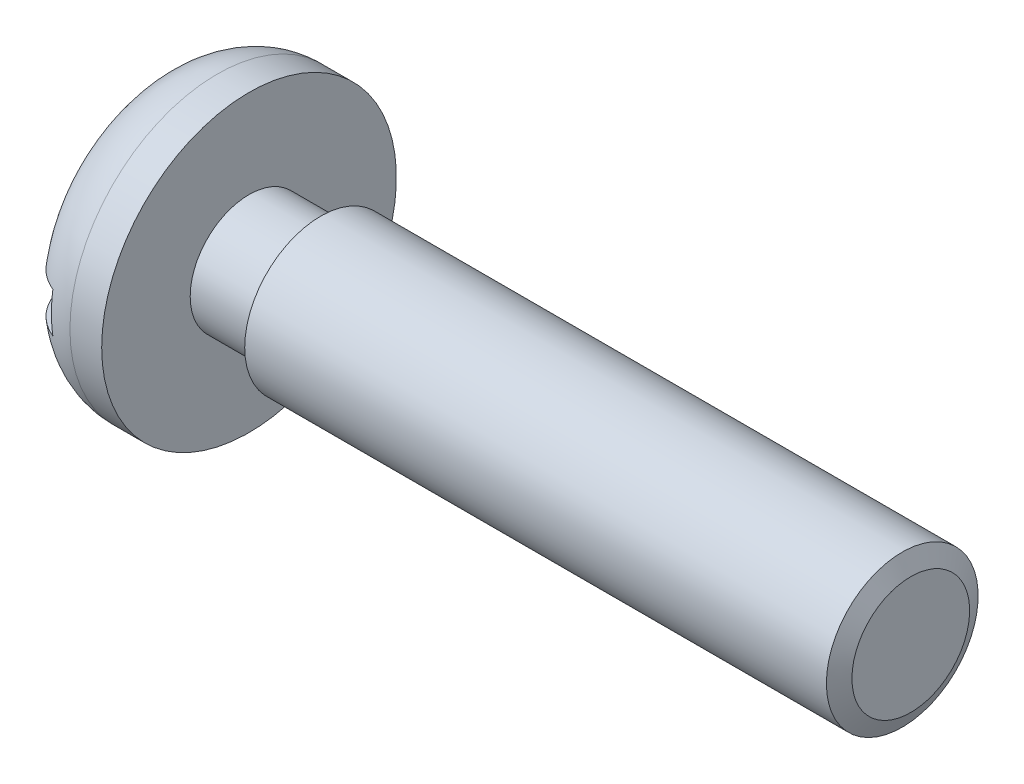
ISO-10303-21;
HEADER;
FILE_DESCRIPTION(('STEP AP214'),'2;1');
FILE_NAME('part.step','',(''),(''),'','','');
FILE_SCHEMA(('AUTOMOTIVE_DESIGN { 1 0 10303 214 1 1 1 1 }'));
ENDSEC;
DATA;
#1=APPLICATION_CONTEXT('core data for automotive mechanical design processes');
#2=APPLICATION_PROTOCOL_DEFINITION('international standard','automotive_design',2000,#1);
#3=PRODUCT_CONTEXT('',#1,'mechanical');
#4=PRODUCT('Part','Part','',(#3));
#5=PRODUCT_RELATED_PRODUCT_CATEGORY('part','',(#4));
#6=PRODUCT_DEFINITION_FORMATION('','',#4);
#7=PRODUCT_DEFINITION_CONTEXT('part definition',#1,'design');
#8=PRODUCT_DEFINITION('design','',#6,#7);
#9=PRODUCT_DEFINITION_SHAPE('','',#8);
#10=(LENGTH_UNIT() NAMED_UNIT(*) SI_UNIT(.MILLI.,.METRE.));
#11=(NAMED_UNIT(*) PLANE_ANGLE_UNIT() SI_UNIT($,.RADIAN.));
#12=(NAMED_UNIT(*) SI_UNIT($,.STERADIAN.) SOLID_ANGLE_UNIT());
#13=UNCERTAINTY_MEASURE_WITH_UNIT(LENGTH_MEASURE(1.E-05),#10,'distance_accuracy_value','');
#14=(GEOMETRIC_REPRESENTATION_CONTEXT(3) GLOBAL_UNCERTAINTY_ASSIGNED_CONTEXT((#13)) GLOBAL_UNIT_ASSIGNED_CONTEXT((#10,
#11,#12)) REPRESENTATION_CONTEXT('',''));
#15=CARTESIAN_POINT('',(0.,0.,0.));
#16=DIRECTION('',(0.,0.,1.));
#17=DIRECTION('',(1.,0.,0.));
#18=AXIS2_PLACEMENT_3D('',#15,#16,#17);
#19=CARTESIAN_POINT('',(-1.3462,1.2319,0.));
#20=DIRECTION('',(1.,0.,0.));
#21=DIRECTION('',(0.,0.,-1.));
#22=AXIS2_PLACEMENT_3D('',#19,#20,#21);
#23=PLANE('',#22);
#24=CARTESIAN_POINT('',(-1.3462,0.,0.));
#25=DIRECTION('',(-1.,0.,0.));
#26=DIRECTION('',(0.,0.,1.));
#27=AXIS2_PLACEMENT_3D('',#24,#25,#26);
#28=CIRCLE('',#27,1.2319);
#29=CARTESIAN_POINT('',(-1.3462,-0.2921,-1.196768649322));
#30=VERTEX_POINT('',#29);
#31=CARTESIAN_POINT('',(-1.3462,-0.2921,1.196768649322));
#32=VERTEX_POINT('',#31);
#33=EDGE_CURVE('E137',#30,#32,#28,.T.);
#34=ORIENTED_EDGE('',*,*,#33,.T.);
#35=DIRECTION('',(0.,0.,-1.));
#36=VECTOR('',#35,1.);
#37=CARTESIAN_POINT('',(-1.3462,-0.2921,0.));
#38=LINE('',#37,#36);
#39=EDGE_CURVE('E138',#32,#30,#38,.T.);
#40=ORIENTED_EDGE('',*,*,#39,.T.);
#41=EDGE_LOOP('',(#34,#40));
#42=FACE_BOUND('',#41,.T.);
#43=ADVANCED_FACE('F15',(#42),#23,.F.);
#44=CARTESIAN_POINT('',(-1.3462,0.2921,1.196768649322));
#45=VERTEX_POINT('',#44);
#46=CARTESIAN_POINT('',(-1.3462,0.2921,-1.196768649322));
#47=VERTEX_POINT('',#46);
#48=EDGE_CURVE('E82',#45,#47,#28,.T.);
#49=ORIENTED_EDGE('',*,*,#48,.T.);
#50=DIRECTION('',(0.,0.,1.));
#51=VECTOR('',#50,1.);
#52=CARTESIAN_POINT('',(-1.3462,0.2921,0.));
#53=LINE('',#52,#51);
#54=EDGE_CURVE('E76',#47,#45,#53,.T.);
#55=ORIENTED_EDGE('',*,*,#54,.T.);
#56=EDGE_LOOP('',(#49,#55));
#57=FACE_BOUND('',#56,.T.);
#58=ADVANCED_FACE('F17',(#57),#23,.F.);
#59=CARTESIAN_POINT('',(9.525,0.,0.));
#60=DIRECTION('',(-1.,0.,0.));
#61=DIRECTION('',(0.,0.,1.));
#62=AXIS2_PLACEMENT_3D('',#59,#60,#61);
#63=PLANE('',#62);
#64=CARTESIAN_POINT('',(9.525,0.,0.));
#65=DIRECTION('',(-1.,0.,0.));
#66=DIRECTION('',(0.,0.,1.));
#67=AXIS2_PLACEMENT_3D('',#64,#65,#66);
#68=CIRCLE('',#67,0.8471);
#69=CARTESIAN_POINT('',(9.525,0.,0.8471));
#70=VERTEX_POINT('',#69);
#71=EDGE_CURVE('E107',#70,#70,#68,.T.);
#72=ORIENTED_EDGE('',*,*,#71,.F.);
#73=EDGE_LOOP('',(#72));
#74=FACE_BOUND('',#73,.T.);
#75=ADVANCED_FACE('F248',(#74),#63,.F.);
#76=CARTESIAN_POINT('',(9.525,0.,0.));
#77=DIRECTION('',(-1.,0.,0.));
#78=DIRECTION('',(0.,0.,1.));
#79=AXIS2_PLACEMENT_3D('',#76,#77,#78);
#80=CONICAL_SURFACE('',#79,0.8471,1.10714871779409);
#81=CARTESIAN_POINT('',(9.40245,0.,0.));
#82=DIRECTION('',(-1.,0.,0.));
#83=DIRECTION('',(0.,0.,1.));
#84=AXIS2_PLACEMENT_3D('',#81,#82,#83);
#85=CIRCLE('',#84,1.0922);
#86=CARTESIAN_POINT('',(9.40245,0.,1.0922));
#87=VERTEX_POINT('',#86);
#88=EDGE_CURVE('E111',#87,#87,#85,.T.);
#89=ORIENTED_EDGE('',*,*,#88,.F.);
#90=EDGE_LOOP('',(#89));
#91=FACE_BOUND('',#90,.T.);
#92=ORIENTED_EDGE('',*,*,#71,.T.);
#93=EDGE_LOOP('',(#92));
#94=FACE_BOUND('',#93,.T.);
#95=ADVANCED_FACE('F237',(#91,#94),#80,.T.);
#96=CARTESIAN_POINT('',(-1.3462,0.,0.));
#97=DIRECTION('',(-1.,0.,0.));
#98=DIRECTION('',(0.,0.,1.));
#99=AXIS2_PLACEMENT_3D('',#96,#97,#98);
#100=CYLINDRICAL_SURFACE('',#99,1.0922);
#101=CARTESIAN_POINT('',(1.02969285714286,0.,0.));
#102=DIRECTION('',(-1.,0.,0.));
#103=DIRECTION('',(0.,0.,1.));
#104=AXIS2_PLACEMENT_3D('',#101,#102,#103);
#105=CIRCLE('',#104,1.0922);
#106=CARTESIAN_POINT('',(1.02969285714286,0.,1.0922));
#107=VERTEX_POINT('',#106);
#108=EDGE_CURVE('E115',#107,#107,#105,.T.);
#109=ORIENTED_EDGE('',*,*,#108,.F.);
#110=EDGE_LOOP('',(#109));
#111=FACE_BOUND('',#110,.T.);
#112=ORIENTED_EDGE('',*,*,#88,.T.);
#113=EDGE_LOOP('',(#112));
#114=FACE_BOUND('',#113,.T.);
#115=ADVANCED_FACE('F226',(#111,#114),#100,.T.);
#116=CARTESIAN_POINT('',(1.02969285714286,0.,0.));
#117=DIRECTION('',(1.,0.,0.));
#118=DIRECTION('',(0.,0.,-1.));
#119=AXIS2_PLACEMENT_3D('',#116,#117,#118);
#120=CONICAL_SURFACE('',#119,1.0922,1.10714871779409);
#121=CARTESIAN_POINT('',(0.907142857142857,0.,0.));
#122=DIRECTION('',(-1.,0.,0.));
#123=DIRECTION('',(0.,0.,1.));
#124=AXIS2_PLACEMENT_3D('',#121,#122,#123);
#125=CIRCLE('',#124,0.8471);
#126=CARTESIAN_POINT('',(0.907142857142857,0.,0.8471));
#127=VERTEX_POINT('',#126);
#128=EDGE_CURVE('E119',#127,#127,#125,.T.);
#129=ORIENTED_EDGE('',*,*,#128,.F.);
#130=EDGE_LOOP('',(#129));
#131=FACE_BOUND('',#130,.T.);
#132=ORIENTED_EDGE('',*,*,#108,.T.);
#133=EDGE_LOOP('',(#132));
#134=FACE_BOUND('',#133,.T.);
#135=ADVANCED_FACE('F215',(#131,#134),#120,.T.);
#136=CARTESIAN_POINT('',(-1.3462,0.,0.));
#137=DIRECTION('',(-1.,0.,0.));
#138=DIRECTION('',(0.,0.,1.));
#139=AXIS2_PLACEMENT_3D('',#136,#137,#138);
#140=CYLINDRICAL_SURFACE('',#139,0.8471);
#141=CARTESIAN_POINT('',(0.,0.,0.));
#142=DIRECTION('',(-1.,0.,0.));
#143=DIRECTION('',(0.,0.,1.));
#144=AXIS2_PLACEMENT_3D('',#141,#142,#143);
#145=CIRCLE('',#144,0.8471);
#146=CARTESIAN_POINT('',(0.,0.,0.8471));
#147=VERTEX_POINT('',#146);
#148=EDGE_CURVE('E123',#147,#147,#145,.T.);
#149=ORIENTED_EDGE('',*,*,#148,.F.);
#150=EDGE_LOOP('',(#149));
#151=FACE_BOUND('',#150,.T.);
#152=ORIENTED_EDGE('',*,*,#128,.T.);
#153=EDGE_LOOP('',(#152));
#154=FACE_BOUND('',#153,.T.);
#155=ADVANCED_FACE('F204',(#151,#154),#140,.T.);
#156=CARTESIAN_POINT('',(0.,0.8471,0.));
#157=DIRECTION('',(-1.,0.,0.));
#158=DIRECTION('',(0.,0.,1.));
#159=AXIS2_PLACEMENT_3D('',#156,#157,#158);
#160=PLANE('',#159);
#161=CARTESIAN_POINT('',(0.,0.,0.));
#162=DIRECTION('',(-1.,0.,0.));
#163=DIRECTION('',(0.,0.,1.));
#164=AXIS2_PLACEMENT_3D('',#161,#162,#163);
#165=CIRCLE('',#164,2.1209);
#166=CARTESIAN_POINT('',(0.,0.,2.1209));
#167=VERTEX_POINT('',#166);
#168=EDGE_CURVE('E127',#167,#167,#165,.T.);
#169=ORIENTED_EDGE('',*,*,#168,.F.);
#170=EDGE_LOOP('',(#169));
#171=FACE_BOUND('',#170,.T.);
#172=ORIENTED_EDGE('',*,*,#148,.T.);
#173=EDGE_LOOP('',(#172));
#174=FACE_BOUND('',#173,.T.);
#175=ADVANCED_FACE('F194',(#171,#174),#160,.F.);
#176=CARTESIAN_POINT('',(-1.3462,0.,0.));
#177=DIRECTION('',(-1.,0.,0.));
#178=DIRECTION('',(0.,0.,1.));
#179=AXIS2_PLACEMENT_3D('',#176,#177,#178);
#180=CYLINDRICAL_SURFACE('',#179,2.1209);
#181=CARTESIAN_POINT('',(-0.4572,0.,0.));
#182=DIRECTION('',(-1.,0.,0.));
#183=DIRECTION('',(0.,0.,1.));
#184=AXIS2_PLACEMENT_3D('',#181,#182,#183);
#185=CIRCLE('',#184,2.1209);
#186=CARTESIAN_POINT('',(-0.4572,0.,2.1209));
#187=VERTEX_POINT('',#186);
#188=EDGE_CURVE('E131',#187,#187,#185,.T.);
#189=ORIENTED_EDGE('',*,*,#188,.F.);
#190=EDGE_LOOP('',(#189));
#191=FACE_BOUND('',#190,.T.);
#192=ORIENTED_EDGE('',*,*,#168,.T.);
#193=EDGE_LOOP('',(#192));
#194=FACE_BOUND('',#193,.T.);
#195=ADVANCED_FACE('F185',(#191,#194),#180,.T.);
#196=CARTESIAN_POINT('',(-0.4572,0.,0.));
#197=DIRECTION('',(-1.,0.,0.));
#198=DIRECTION('',(0.,0.,1.));
#199=AXIS2_PLACEMENT_3D('',#196,#197,#198);
#200=TOROIDAL_SURFACE('',#199,1.2319,0.889);
#201=CARTESIAN_POINT('',(-0.7874,0.,0.));
#202=DIRECTION('',(1.,0.,0.));
#203=DIRECTION('',(0.,0.,-1.));
#204=AXIS2_PLACEMENT_3D('',#201,#202,#203);
#205=CIRCLE('',#204,2.05730230191102);
#206=CARTESIAN_POINT('',(-0.7874,0.2921,2.03646025039733));
#207=VERTEX_POINT('',#206);
#208=CARTESIAN_POINT('',(-0.7874,-0.2921,2.03646025039733));
#209=VERTEX_POINT('',#208);
#210=EDGE_CURVE('E61',#207,#209,#205,.T.);
#211=ORIENTED_EDGE('',*,*,#210,.T.);
#212=CARTESIAN_POINT('',(-0.992672438637413,-0.2921,0.432934305643319));
#213=CARTESIAN_POINT('',(-0.951976302403638,-0.2921,0.395882314610575));
#214=CARTESIAN_POINT('',(-0.908727308114687,-0.2921,0.361624142766205));
#215=CARTESIAN_POINT('',(-0.840630830973308,-0.2921,0.314956422780139));
#216=CARTESIAN_POINT('',(-0.817376844307591,-0.2921,0.300178124351799));
#217=CARTESIAN_POINT('',(-0.769830336334795,-0.2921,0.272408816585435));
#218=CARTESIAN_POINT('',(-0.745538319363267,-0.2921,0.259416951949301));
#219=CARTESIAN_POINT('',(-0.691476053082714,-0.2921,0.233453302492282));
#220=CARTESIAN_POINT('',(-0.661501470432795,-0.2921,0.22089837012876));
#221=CARTESIAN_POINT('',(-0.600181210266825,-0.2921,0.200024753087824));
#222=CARTESIAN_POINT('',(-0.568842288590604,-0.2921,0.191687312499439));
#223=CARTESIAN_POINT('',(-0.509599457312778,-0.2921,0.181785972508896));
#224=CARTESIAN_POINT('',(-0.481836724849506,-0.2921,0.179430749928932));
#225=CARTESIAN_POINT('',(-0.426342853074537,-0.2921,0.179800268752367));
#226=CARTESIAN_POINT('',(-0.398611722176877,-0.2921,0.182526141735702));
#227=CARTESIAN_POINT('',(-0.334096578427921,-0.2921,0.194097869512075));
#228=CARTESIAN_POINT('',(-0.297666095143047,-0.2921,0.20480069646197));
#229=CARTESIAN_POINT('',(-0.226665266455918,-0.2921,0.231455710401772));
#230=CARTESIAN_POINT('',(-0.192108063254158,-0.2921,0.247440493728884));
#231=CARTESIAN_POINT('',(-0.129893014009047,-0.2921,0.280465132785374));
#232=CARTESIAN_POINT('',(-0.101966495091048,-0.2921,0.297006626603626));
#233=CARTESIAN_POINT('',(-0.0475848363779582,-0.2921,0.332362694096872));
#234=CARTESIAN_POINT('',(-0.021130508844512,-0.2921,0.351178504787953));
#235=CARTESIAN_POINT('',(0.0557498887027582,-0.2921,0.410647327942976));
#236=CARTESIAN_POINT('',(0.103837699645755,-0.2921,0.45440039799162));
#237=CARTESIAN_POINT('',(0.19267941328707,-0.2921,0.54994205808474));
#238=CARTESIAN_POINT('',(0.233325092281033,-0.2921,0.601831512275902));
#239=CARTESIAN_POINT('',(0.30452091587593,-0.2921,0.712152698523906));
#240=CARTESIAN_POINT('',(0.335078076750835,-0.2921,0.770579845778615));
#241=CARTESIAN_POINT('',(0.382651320036513,-0.2921,0.888038597832505));
#242=CARTESIAN_POINT('',(0.400457200702972,-0.2921,0.946749442702547));
#243=CARTESIAN_POINT('',(0.424745459936411,-0.2921,1.06648802241002));
#244=CARTESIAN_POINT('',(0.431231788575531,-0.2921,1.12751494143121));
#245=CARTESIAN_POINT('',(0.432243697825684,-0.2921,1.24352816725672));
#246=CARTESIAN_POINT('',(0.427904016121639,-0.2921,1.29850622045822));
#247=CARTESIAN_POINT('',(0.409535255455774,-0.2921,1.40681520034198));
#248=CARTESIAN_POINT('',(0.395510450915781,-0.2921,1.46014684280614));
#249=CARTESIAN_POINT('',(0.359061437997411,-0.2921,1.56072841183747));
#250=CARTESIAN_POINT('',(0.337110558223342,-0.2921,1.60815030380737));
#251=CARTESIAN_POINT('',(0.285352482255086,-0.2921,1.69849554453694));
#252=CARTESIAN_POINT('',(0.255546454905018,-0.2921,1.74141956125242));
#253=CARTESIAN_POINT('',(0.189795813324276,-0.2921,1.82038320852261));
#254=CARTESIAN_POINT('',(0.154031761032469,-0.2921,1.85657330582249));
#255=CARTESIAN_POINT('',(0.0768609189134639,-0.2921,1.92233195432511));
#256=CARTESIAN_POINT('',(0.0354546294751286,-0.2921,1.95190109210192));
#257=CARTESIAN_POINT('',(-0.051199372290232,-0.2921,2.00316417171778));
#258=CARTESIAN_POINT('',(-0.0963859756334818,-0.2921,2.02496146011344));
#259=CARTESIAN_POINT('',(-0.189794863444509,-0.2921,2.06059947774309));
#260=CARTESIAN_POINT('',(-0.238017013247673,-0.2921,2.07444055965917));
#261=CARTESIAN_POINT('',(-0.335764668045911,-0.2921,2.09368641852875));
#262=CARTESIAN_POINT('',(-0.385278691349902,-0.2921,2.09914955190282));
#263=CARTESIAN_POINT('',(-0.484519453606647,-0.2921,2.10166360796056));
#264=CARTESIAN_POINT('',(-0.534246188283067,-0.2921,2.09871469897306));
#265=CARTESIAN_POINT('',(-0.632375738931346,-0.2921,2.0845089698509));
#266=CARTESIAN_POINT('',(-0.680781443517738,-0.2921,2.07327208755944));
#267=CARTESIAN_POINT('',(-0.77502314738635,-0.2921,2.04284266210274));
#268=CARTESIAN_POINT('',(-0.820859151169377,-0.2921,2.02365013287223));
#269=CARTESIAN_POINT('',(-0.908739661466676,-0.2921,1.97783533101026));
#270=CARTESIAN_POINT('',(-0.950778430758976,-0.2921,1.9512020567031));
#271=CARTESIAN_POINT('',(-1.02981938083941,-0.2921,1.89129319939671));
#272=CARTESIAN_POINT('',(-1.06682148964855,-0.2921,1.85801752148754));
#273=CARTESIAN_POINT('',(-1.13497797888147,-0.2921,1.78557604040786));
#274=CARTESIAN_POINT('',(-1.16609763403501,-0.2921,1.74637757680937));
#275=CARTESIAN_POINT('',(-1.22139984472465,-0.2921,1.66336245659058));
#276=CARTESIAN_POINT('',(-1.2455821264248,-0.2921,1.61954561776446));
#277=CARTESIAN_POINT('',(-1.28664519432551,-0.2921,1.52800704096665));
#278=CARTESIAN_POINT('',(-1.30343834606938,-0.2921,1.48024601864444));
#279=CARTESIAN_POINT('',(-1.32894363580326,-0.2921,1.38261880771803));
#280=CARTESIAN_POINT('',(-1.33765541348183,-0.2921,1.33275252535354));
#281=CARTESIAN_POINT('',(-1.34698928328245,-0.2921,1.23122253976434));
#282=CARTESIAN_POINT('',(-1.34743873377999,-0.2921,1.17954304448759));
#283=CARTESIAN_POINT('',(-1.33997550050584,-0.2921,1.0767962437406));
#284=CARTESIAN_POINT('',(-1.33206131228534,-0.2921,1.02572905008238));
#285=CARTESIAN_POINT('',(-1.30785496246849,-0.2921,0.923599249518503));
#286=CARTESIAN_POINT('',(-1.29125928355239,-0.2921,0.872608860886494));
#287=CARTESIAN_POINT('',(-1.25027871991642,-0.2921,0.773888674672268));
#288=CARTESIAN_POINT('',(-1.22589419258904,-0.2921,0.726158727606152));
#289=CARTESIAN_POINT('',(-1.17009543264154,-0.2921,0.634594296147874));
#290=CARTESIAN_POINT('',(-1.13863614956343,-0.2921,0.590787409837325));
#291=CARTESIAN_POINT('',(-1.06982489913658,-0.2921,0.508072521804637));
#292=CARTESIAN_POINT('',(-1.03246931055133,-0.2921,0.469167557193672));
#293=CARTESIAN_POINT('',(-0.992672438637413,-0.2921,0.432934305643319));
#294=B_SPLINE_CURVE_WITH_KNOTS('',3,(#212,#213,#214,#215,#216,#217,#218,#219,#220,#221,#222,
#223,#224,#225,#226,#227,#228,#229,#230,#231,#232,#233,#234,#235,#236,#237,#238,#239,#240,#241,
#242,#243,#244,#245,#246,#247,#248,#249,#250,#251,#252,#253,#254,#255,#256,#257,#258,#259,#260,
#261,#262,#263,#264,#265,#266,#267,#268,#269,#270,#271,#272,#273,#274,#275,#276,#277,#278,#279,
#280,#281,#282,#283,#284,#285,#286,#287,#288,#289,#290,#291,#292,#293),.UNSPECIFIED.,.T.,.F.,(4,
2,2,2,2,2,2,2,2,2,2,2,2,2,2,2,2,2,2,2,2,2,2,2,2,2,2,2,2,2,2,2,2,2,2,2,2,2,2,2,4),(0.,
0.16495775981017,0.24755626720245,0.330115089844927,0.427398573052825,0.524245530215674,
0.60739299954584,0.69055898835636,0.803805959361426,0.91776528282531,1.01501518531125,
1.11231822271878,1.30643675482596,1.50318604715208,1.69979821634306,1.88282418140949,
2.06578626493389,2.23039162657576,2.39492438785135,2.55092420669776,2.70690082590108,
2.8588056311825,3.01069697335346,3.16048575872783,3.31026790376476,3.45900192815745,
3.60773297633499,3.75610739400144,3.90448155178353,4.05307626315311,4.20167309786912,
4.3511214611586,4.50057572274764,4.65175763003305,4.80294627750292,4.95729050769183,
5.11166250600081,5.27183282781698,5.43199580124925,5.59320908443223,5.75452176533789),.UNSPECIFIED.);
#295=EDGE_CURVE('E10',#209,#32,#294,.T.);
#296=ORIENTED_EDGE('',*,*,#295,.T.);
#297=ORIENTED_EDGE('',*,*,#33,.F.);
#298=CARTESIAN_POINT('',(-1.06697298726154,-0.2921,-1.85596879314736));
#299=CARTESIAN_POINT('',(-1.03098548144302,-0.2921,-1.89030721062701));
#300=CARTESIAN_POINT('',(-0.992107884086906,-0.2921,-1.9216253737167));
#301=CARTESIAN_POINT('',(-0.909644399354977,-0.2921,-1.97730508815571));
#302=CARTESIAN_POINT('',(-0.866057577568001,-0.2921,-2.00166525538257));
#303=CARTESIAN_POINT('',(-0.775399479777941,-0.2921,-2.04271054069887));
#304=CARTESIAN_POINT('',(-0.728327719279927,-0.2921,-2.05939458927808));
#305=CARTESIAN_POINT('',(-0.632046826721519,-0.2921,-2.08458876370733));
#306=CARTESIAN_POINT('',(-0.582837789836314,-0.2921,-2.09309925314537));
#307=CARTESIAN_POINT('',(-0.483872766325003,-0.2921,-2.10168005939517));
#308=CARTESIAN_POINT('',(-0.43411946886111,-0.2921,-2.10178141268704));
#309=CARTESIAN_POINT('',(-0.335304317498453,-0.2921,-2.09361914516227));
#310=CARTESIAN_POINT('',(-0.286242456640679,-0.2921,-2.08535560859567));
#311=CARTESIAN_POINT('',(-0.190258784568471,-0.2921,-2.06072057304478));
#312=CARTESIAN_POINT('',(-0.143334606238082,-0.2921,-2.04435829270059));
#313=CARTESIAN_POINT('',(-0.0528890535515041,-0.2921,-2.00400875494042));
#314=CARTESIAN_POINT('',(-0.00936769366654838,-0.2921,-1.98002146509961));
#315=CARTESIAN_POINT('',(0.0731727925832212,-0.2921,-1.9250437981044));
#316=CARTESIAN_POINT('',(0.112179208450556,-0.2921,-1.89403434353768));
#317=CARTESIAN_POINT('',(0.184477690524985,-0.2921,-1.82595030639236));
#318=CARTESIAN_POINT('',(0.217769648109022,-0.2921,-1.78887560854899));
#319=CARTESIAN_POINT('',(0.277970868440114,-0.2921,-1.70943388883647));
#320=CARTESIAN_POINT('',(0.304831471891644,-0.2921,-1.66703000719749));
#321=CARTESIAN_POINT('',(0.351162133369711,-0.2921,-1.57836386916823));
#322=CARTESIAN_POINT('',(0.37063182752706,-0.2921,-1.53210142294986));
#323=CARTESIAN_POINT('',(0.401948275669985,-0.2921,-1.43634785180313));
#324=CARTESIAN_POINT('',(0.413684268389264,-0.2921,-1.38682053982095));
#325=CARTESIAN_POINT('',(0.428889824774922,-0.2921,-1.28651981559142));
#326=CARTESIAN_POINT('',(0.432358956784081,-0.2921,-1.23574633841493));
#327=CARTESIAN_POINT('',(0.431078862405955,-0.2921,-1.13303224849355));
#328=CARTESIAN_POINT('',(0.426121042227419,-0.2921,-1.08109434943144));
#329=CARTESIAN_POINT('',(0.407936632360012,-0.2921,-0.978693150561658));
#330=CARTESIAN_POINT('',(0.394708332033858,-0.2921,-0.928230158079346));
#331=CARTESIAN_POINT('',(0.359808634821553,-0.2921,-0.827747809325714));
#332=CARTESIAN_POINT('',(0.337781453922837,-0.2921,-0.777852421282294));
#333=CARTESIAN_POINT('',(0.286279522453327,-0.2921,-0.682098190054024));
#334=CARTESIAN_POINT('',(0.256804592194011,-0.2921,-0.636239444295439));
#335=CARTESIAN_POINT('',(0.188793411919309,-0.2921,-0.545776261529059));
#336=CARTESIAN_POINT('',(0.149712472283708,-0.2921,-0.50158272253969));
#337=CARTESIAN_POINT('',(0.0654029337913393,-0.2921,-0.41943681508496));
#338=CARTESIAN_POINT('',(0.0201666005199633,-0.2921,-0.38149243359891));
#339=CARTESIAN_POINT('',(-0.0655144480877994,-0.2921,-0.319656520268563));
#340=CARTESIAN_POINT('',(-0.105030774172858,-0.2921,-0.294479834363365));
#341=CARTESIAN_POINT('',(-0.166517885754436,-0.2921,-0.260777339308461));
#342=CARTESIAN_POINT('',(-0.187380638483858,-0.2921,-0.250220931364947));
#343=CARTESIAN_POINT('',(-0.22985543169453,-0.2921,-0.230757236114179));
#344=CARTESIAN_POINT('',(-0.251467077599952,-0.2921,-0.221849095595576));
#345=CARTESIAN_POINT('',(-0.30141375983301,-0.2921,-0.203993981505409));
#346=CARTESIAN_POINT('',(-0.329988040695985,-0.2921,-0.195686487556193));
#347=CARTESIAN_POINT('',(-0.388020025038903,-0.2921,-0.183882848722512));
#348=CARTESIAN_POINT('',(-0.417471947697693,-0.2921,-0.180360265915577));
#349=CARTESIAN_POINT('',(-0.476684100732781,-0.2921,-0.179069970047914));
#350=CARTESIAN_POINT('',(-0.506445129601433,-0.2921,-0.181335562051191));
#351=CARTESIAN_POINT('',(-0.565212057501611,-0.2921,-0.191005491205652));
#352=CARTESIAN_POINT('',(-0.594213100956741,-0.2921,-0.198437083159847));
#353=CARTESIAN_POINT('',(-0.645881942505189,-0.2921,-0.215317364373907));
#354=CARTESIAN_POINT('',(-0.668755620572376,-0.2921,-0.224168557723448));
#355=CARTESIAN_POINT('',(-0.713679278072415,-0.2921,-0.243778326687423));
#356=CARTESIAN_POINT('',(-0.735728656526258,-0.2921,-0.254538262309401));
#357=CARTESIAN_POINT('',(-0.800727778021493,-0.2921,-0.289148454517574));
#358=CARTESIAN_POINT('',(-0.842453164995195,-0.2921,-0.315301690704514));
#359=CARTESIAN_POINT('',(-0.936436817387702,-0.2921,-0.382491279483391));
#360=CARTESIAN_POINT('',(-0.987265338494482,-0.2921,-0.425532053164752));
#361=CARTESIAN_POINT('',(-1.08091844661583,-0.2921,-0.519471660579893));
#362=CARTESIAN_POINT('',(-1.12375749870863,-0.2921,-0.570355982126777));
#363=CARTESIAN_POINT('',(-1.1993519535428,-0.2921,-0.678768612122051));
#364=CARTESIAN_POINT('',(-1.23216234462503,-0.2921,-0.736258221148343));
#365=CARTESIAN_POINT('',(-1.2861633281036,-0.2921,-0.856512120051585));
#366=CARTESIAN_POINT('',(-1.30735531410856,-0.2921,-0.919275776273221));
#367=CARTESIAN_POINT('',(-1.33494887975992,-0.2921,-1.04014019393372));
#368=CARTESIAN_POINT('',(-1.3428076709284,-0.2921,-1.09790993294163));
#369=CARTESIAN_POINT('',(-1.34782264907081,-0.2921,-1.21390959589146));
#370=CARTESIAN_POINT('',(-1.34498520279187,-0.2921,-1.27213922549821));
#371=CARTESIAN_POINT('',(-1.3291314528051,-0.2921,-1.38250251927555));
#372=CARTESIAN_POINT('',(-1.31693458217976,-0.2921,-1.43475505322979));
#373=CARTESIAN_POINT('',(-1.28358835438538,-0.2921,-1.53631137202184));
#374=CARTESIAN_POINT('',(-1.26244379484754,-0.2921,-1.58561672095573));
#375=CARTESIAN_POINT('',(-1.21483378384803,-0.2921,-1.67403025523813));
#376=CARTESIAN_POINT('',(-1.18931514441613,-0.2921,-1.71365149524175));
#377=CARTESIAN_POINT('',(-1.13238106226083,-0.2921,-1.78840264887311));
#378=CARTESIAN_POINT('',(-1.10096636246282,-0.2921,-1.82353312741687));
#379=CARTESIAN_POINT('',(-1.06697298726154,-0.2921,-1.85596879314736));
#380=B_SPLINE_CURVE_WITH_KNOTS('',3,(#298,#299,#300,#301,#302,#303,#304,#305,#306,#307,#308,
#309,#310,#311,#312,#313,#314,#315,#316,#317,#318,#319,#320,#321,#322,#323,#324,#325,#326,#327,
#328,#329,#330,#331,#332,#333,#334,#335,#336,#337,#338,#339,#340,#341,#342,#343,#344,#345,#346,
#347,#348,#349,#350,#351,#352,#353,#354,#355,#356,#357,#358,#359,#360,#361,#362,#363,#364,#365,
#366,#367,#368,#369,#370,#371,#372,#373,#374,#375,#376,#377,#378,#379),.UNSPECIFIED.,.T.,.F.,(4,
2,2,2,2,2,2,2,2,2,2,2,2,2,2,2,2,2,2,2,2,2,2,2,2,2,2,2,2,2,2,2,2,2,2,2,2,2,2,2,4),(0.,
0.14905902386792,0.298147678751285,0.447257099805331,0.596359887652682,0.744912341640851,
0.89346329944394,1.04184555215146,1.19022843585283,1.33901937952592,1.48781315117269,
1.63769943053109,1.78759308813289,1.93958936812845,2.09159358449268,2.24741541426667,
2.40326948435204,2.56619358506477,2.72912161694988,2.90540399980085,3.08190996752683,
3.22210912823777,3.2921977247132,3.36224993830917,3.451224485425,3.53970539675627,
3.62869657101617,3.71816084426597,3.79164316554849,3.86517805593972,4.01248592577054,
4.21139011458747,4.40993061153603,4.60736210675416,4.80476991520433,4.97874179997717,
5.15261014740244,5.31278224788245,5.47286857482533,5.61368570915038,5.75448511189392),.UNSPECIFIED.);
#381=CARTESIAN_POINT('',(-0.7874,-0.2921,-2.03646025039733));
#382=VERTEX_POINT('',#381);
#383=EDGE_CURVE('E43',#30,#382,#380,.T.);
#384=ORIENTED_EDGE('',*,*,#383,.T.);
#385=CARTESIAN_POINT('',(-0.7874,0.2921,-2.03646025039733));
#386=VERTEX_POINT('',#385);
#387=EDGE_CURVE('E68',#382,#386,#205,.T.);
#388=ORIENTED_EDGE('',*,*,#387,.T.);
#389=CARTESIAN_POINT('',(-1.06697298726154,0.2921,-1.85596879314736));
#390=CARTESIAN_POINT('',(-1.10354708191385,0.2921,-1.8210667472002));
#391=CARTESIAN_POINT('',(-1.13716869677334,0.2921,-1.78301322630452));
#392=CARTESIAN_POINT('',(-1.19753583165128,0.2921,-1.70174544545054));
#393=CARTESIAN_POINT('',(-1.22427214476066,0.2921,-1.65852438740261));
#394=CARTESIAN_POINT('',(-1.27010367740325,0.2921,-1.56826934336279));
#395=CARTESIAN_POINT('',(-1.28920801116125,0.2921,-1.52123998654877));
#396=CARTESIAN_POINT('',(-1.31936631369945,0.2921,-1.42469028143375));
#397=CARTESIAN_POINT('',(-1.33042258060802,0.2921,-1.37517064855333));
#398=CARTESIAN_POINT('',(-1.3444171370963,0.2921,-1.27425757644573));
#399=CARTESIAN_POINT('',(-1.34723340776844,0.2921,-1.22284727839722));
#400=CARTESIAN_POINT('',(-1.34449205791633,0.2921,-1.12025065901046));
#401=CARTESIAN_POINT('',(-1.3389323687076,0.2921,-1.06906439613576));
#402=CARTESIAN_POINT('',(-1.31946016188711,0.2921,-0.966473499845394));
#403=CARTESIAN_POINT('',(-1.30526492171769,0.2921,-0.915122743630748));
#404=CARTESIAN_POINT('',(-1.2689597835808,0.2921,-0.815335009058525));
#405=CARTESIAN_POINT('',(-1.24685117327621,0.2921,-0.766897558145079));
#406=CARTESIAN_POINT('',(-1.1939911224401,0.2921,-0.67101952646385));
#407=CARTESIAN_POINT('',(-1.16278700313543,0.2921,-0.623829098727242));
#408=CARTESIAN_POINT('',(-1.09360263837529,0.2921,-0.534667399266872));
#409=CARTESIAN_POINT('',(-1.05561334737469,0.2921,-0.492703223174028));
#410=CARTESIAN_POINT('',(-0.969581240619593,0.2921,-0.410267090352194));
#411=CARTESIAN_POINT('',(-0.920892646937336,0.2921,-0.370464284514564));
#412=CARTESIAN_POINT('',(-0.843677993687896,0.2921,-0.316835843256897));
#413=CARTESIAN_POINT('',(-0.817219651673264,0.2921,-0.299961108071455));
#414=CARTESIAN_POINT('',(-0.762963103697467,0.2921,-0.268540844362752));
#415=CARTESIAN_POINT('',(-0.735165994716016,0.2921,-0.253993449692668));
#416=CARTESIAN_POINT('',(-0.677570247336987,0.2921,-0.227522190381186));
#417=CARTESIAN_POINT('',(-0.647740831184659,0.2921,-0.215663922683793));
#418=CARTESIAN_POINT('',(-0.586816178107002,0.2921,-0.196329123679199));
#419=CARTESIAN_POINT('',(-0.555729797897136,0.2921,-0.188826239385564));
#420=CARTESIAN_POINT('',(-0.492099654757595,0.2921,-0.179866088840567));
#421=CARTESIAN_POINT('',(-0.459540534988772,0.2921,-0.178507430150808));
#422=CARTESIAN_POINT('',(-0.394805687860516,0.2921,-0.18263583016526));
#423=CARTESIAN_POINT('',(-0.362631540001973,0.2921,-0.188145031534325));
#424=CARTESIAN_POINT('',(-0.289499772419427,0.2921,-0.20687927202918));
#425=CARTESIAN_POINT('',(-0.249070384282891,0.2921,-0.22202472634886));
#426=CARTESIAN_POINT('',(-0.170637726489418,0.2921,-0.257823025914493));
#427=CARTESIAN_POINT('',(-0.132647305203846,0.2921,-0.27850247413932));
#428=CARTESIAN_POINT('',(-0.0675149535839641,0.2921,-0.31886513611093));
#429=CARTESIAN_POINT('',(-0.0398569105660963,0.2921,-0.337723568663297));
#430=CARTESIAN_POINT('',(0.0137983112234526,0.2921,-0.377676168452173));
#431=CARTESIAN_POINT('',(0.0397948540346582,0.2921,-0.398771183651823));
#432=CARTESIAN_POINT('',(0.114893648233122,0.2921,-0.4650991006688));
#433=CARTESIAN_POINT('',(0.161287853246664,0.2921,-0.513488904302052));
#434=CARTESIAN_POINT('',(0.244603002868148,0.2921,-0.617493032025491));
#435=CARTESIAN_POINT('',(0.281565588738332,0.2921,-0.673073907263759));
#436=CARTESIAN_POINT('',(0.344323119589687,0.2921,-0.79028222891346));
#437=CARTESIAN_POINT('',(0.370120497043002,0.2921,-0.851908354703502));
#438=CARTESIAN_POINT('',(0.406821920435411,0.2921,-0.972278101098645));
#439=CARTESIAN_POINT('',(0.419021537327799,0.2921,-1.03062751120777));
#440=CARTESIAN_POINT('',(0.432411449928743,0.2921,-1.14857654095137));
#441=CARTESIAN_POINT('',(0.433608397243461,0.2921,-1.20817538340048));
#442=CARTESIAN_POINT('',(0.425076733491273,0.2921,-1.32124494827329));
#443=CARTESIAN_POINT('',(0.416309639352548,0.2921,-1.37478956577665));
#444=CARTESIAN_POINT('',(0.38949018281249,0.2921,-1.47950114415257));
#445=CARTESIAN_POINT('',(0.371440696282024,0.2921,-1.53066883609386));
#446=CARTESIAN_POINT('',(0.327506306053366,0.2921,-1.62680340605762));
#447=CARTESIAN_POINT('',(0.302000858102529,0.2921,-1.67194401480272));
#448=CARTESIAN_POINT('',(0.243608134125021,0.2921,-1.75716890252439));
#449=CARTESIAN_POINT('',(0.210721868863854,0.2921,-1.7972538726721));
#450=CARTESIAN_POINT('',(0.13932252759408,0.2921,-1.870295555313));
#451=CARTESIAN_POINT('',(0.100952569515406,0.2921,-1.90339226018181));
#452=CARTESIAN_POINT('',(0.0191439931503264,0.2921,-1.96258061041663));
#453=CARTESIAN_POINT('',(-0.0242942576031772,0.2921,-1.98867276327318));
#454=CARTESIAN_POINT('',(-0.114442985584297,0.2921,-2.03280024919016));
#455=CARTESIAN_POINT('',(-0.161108306044845,0.2921,-2.05092787741118));
#456=CARTESIAN_POINT('',(-0.256828616574534,0.2921,-2.07903907989231));
#457=CARTESIAN_POINT('',(-0.305883420499071,0.2921,-2.08902328746617));
#458=CARTESIAN_POINT('',(-0.404680863880405,0.2921,-2.10051885060317));
#459=CARTESIAN_POINT('',(-0.454417728990386,0.2921,-2.10207990462215));
#460=CARTESIAN_POINT('',(-0.553459025209268,0.2921,-2.09681555488842));
#461=CARTESIAN_POINT('',(-0.602763350540307,0.2921,-2.08998815431135));
#462=CARTESIAN_POINT('',(-0.699470778389757,0.2921,-2.06815921131793));
#463=CARTESIAN_POINT('',(-0.746875711137688,0.2921,-2.05316575138903));
#464=CARTESIAN_POINT('',(-0.838460214594292,0.2921,-2.01545719792333));
#465=CARTESIAN_POINT('',(-0.882643669031893,0.2921,-1.99275159536316));
#466=CARTESIAN_POINT('',(-0.950126224020824,0.2921,-1.95058947004561));
#467=CARTESIAN_POINT('',(-0.974831566965626,0.2921,-1.93333882922593));
#468=CARTESIAN_POINT('',(-1.0223646257502,0.2921,-1.89642093639501));
#469=CARTESIAN_POINT('',(-1.04519234789128,0.2921,-1.87675369249446));
#470=CARTESIAN_POINT('',(-1.06697298726154,0.2921,-1.85596879314736));
#471=B_SPLINE_CURVE_WITH_KNOTS('',3,(#389,#390,#391,#392,#393,#394,#395,#396,#397,#398,#399,
#400,#401,#402,#403,#404,#405,#406,#407,#408,#409,#410,#411,#412,#413,#414,#415,#416,#417,#418,
#419,#420,#421,#422,#423,#424,#425,#426,#427,#428,#429,#430,#431,#432,#433,#434,#435,#436,#437,
#438,#439,#440,#441,#442,#443,#444,#445,#446,#447,#448,#449,#450,#451,#452,#453,#454,#455,#456,
#457,#458,#459,#460,#461,#462,#463,#464,#465,#466,#467,#468,#469,#470),.UNSPECIFIED.,.T.,.F.,(4,
2,2,2,2,2,2,2,2,2,2,2,2,2,2,2,2,2,2,2,2,2,2,2,2,2,2,2,2,2,2,2,2,2,2,2,2,2,2,2,4),(0.,
0.151553294671669,0.303308203737549,0.454881339128215,0.606411175758905,0.760173804038181,
0.913974414652259,1.07310367866105,1.23220706093292,1.40122367501286,1.57046731601042,
1.75828416091654,1.85234530689232,1.94633064903589,2.04240778370168,2.13789735935502,
2.2349141139832,2.33224447083601,2.46108211725033,2.59055059706016,2.69085695205165,
2.79120147344967,2.9912519185574,3.19040321748087,3.38951110708164,3.56737094438813,
3.74512325038649,3.90707844517397,4.06898349320366,4.22376895284519,4.37853322832289,
4.52981822565385,4.68109225919464,4.83056381413552,4.98002374356625,5.12860085443755,
5.27721334010655,5.4256790008002,5.57396260972703,5.66421607372687,5.75446923482352),.UNSPECIFIED.);
#472=EDGE_CURVE('E73',#386,#47,#471,.T.);
#473=ORIENTED_EDGE('',*,*,#472,.T.);
#474=ORIENTED_EDGE('',*,*,#48,.F.);
#475=CARTESIAN_POINT('',(-0.992672438637413,0.2921,0.432934305643319));
#476=CARTESIAN_POINT('',(-1.03333456684423,0.2921,0.469948338841257));
#477=CARTESIAN_POINT('',(-1.07148843817075,0.2921,0.509808241153908));
#478=CARTESIAN_POINT('',(-1.14167887983379,0.2921,0.5947272768767));
#479=CARTESIAN_POINT('',(-1.1737017815332,0.2921,0.639797676382588));
#480=CARTESIAN_POINT('',(-1.23491895411966,0.2921,0.741910381809854));
#481=CARTESIAN_POINT('',(-1.26285885487328,0.2921,0.799717688927357));
#482=CARTESIAN_POINT('',(-1.30726592616864,0.2921,0.919574267676036));
#483=CARTESIAN_POINT('',(-1.32374140365399,0.2921,0.981620432022221));
#484=CARTESIAN_POINT('',(-1.34302772331272,0.2921,1.10090869677891));
#485=CARTESIAN_POINT('',(-1.34712444107769,0.2921,1.15794399884215));
#486=CARTESIAN_POINT('',(-1.34492695451888,0.2921,1.27181840283125));
#487=CARTESIAN_POINT('',(-1.33863681962798,0.2921,1.32865757285694));
#488=CARTESIAN_POINT('',(-1.3164802014046,0.2921,1.4363191599275));
#489=CARTESIAN_POINT('',(-1.30130864964578,0.2921,1.48728537501478));
#490=CARTESIAN_POINT('',(-1.26232303251889,0.2921,1.58579690859994));
#491=CARTESIAN_POINT('',(-1.23851120081606,0.2921,1.63334310742949));
#492=CARTESIAN_POINT('',(-1.18385408744841,0.2921,1.721959157848));
#493=CARTESIAN_POINT('',(-1.15327778819402,0.2921,1.7631951068635));
#494=CARTESIAN_POINT('',(-1.08551990157368,0.2921,1.83982827752177));
#495=CARTESIAN_POINT('',(-1.04833898811767,0.2921,1.87522609415561));
#496=CARTESIAN_POINT('',(-0.969161575592352,0.2921,1.93852553506276));
#497=CARTESIAN_POINT('',(-0.927263403596521,0.2921,1.96655021710779));
#498=CARTESIAN_POINT('',(-0.839321742598209,0.2921,2.0150893777363));
#499=CARTESIAN_POINT('',(-0.793278506609761,0.2921,2.03560431432669));
#500=CARTESIAN_POINT('',(-0.698823067838481,0.2921,2.06835426489365));
#501=CARTESIAN_POINT('',(-0.650437248809748,0.2921,2.08066541233163));
#502=CARTESIAN_POINT('',(-0.552282703091649,0.2921,2.09695228335801));
#503=CARTESIAN_POINT('',(-0.502514015818466,0.2921,2.10092824427951));
#504=CARTESIAN_POINT('',(-0.403225727948086,0.2921,2.10042853287458));
#505=CARTESIAN_POINT('',(-0.353705947801562,0.2921,2.09598771247336));
#506=CARTESIAN_POINT('',(-0.256115882485352,0.2921,2.07885393942704));
#507=CARTESIAN_POINT('',(-0.208045584289153,0.2921,2.06616106096642));
#508=CARTESIAN_POINT('',(-0.114719119007319,0.2921,2.03289672715428));
#509=CARTESIAN_POINT('',(-0.0694626875103121,0.2921,2.01232601336591));
#510=CARTESIAN_POINT('',(0.0169716202905612,0.2921,1.96390652087445));
#511=CARTESIAN_POINT('',(0.0581494645855646,0.2921,1.9360576850587));
#512=CARTESIAN_POINT('',(0.135437925997495,0.2921,1.87376856405731));
#513=CARTESIAN_POINT('',(0.171528288244165,0.2921,1.8393031539256));
#514=CARTESIAN_POINT('',(0.237470055917949,0.2921,1.76484954032957));
#515=CARTESIAN_POINT('',(0.267321290183624,0.2921,1.72486118540121));
#516=CARTESIAN_POINT('',(0.320238655220381,0.2921,1.64012881079125));
#517=CARTESIAN_POINT('',(0.343242224523612,0.2921,1.59534573848347));
#518=CARTESIAN_POINT('',(0.381537662727684,0.2921,1.50259985769432));
#519=CARTESIAN_POINT('',(0.39682918447164,0.2921,1.45463690618102));
#520=CARTESIAN_POINT('',(0.41956932412473,0.2921,1.35605814621591));
#521=CARTESIAN_POINT('',(0.426884840358412,0.2921,1.30541168386319));
#522=CARTESIAN_POINT('',(0.433162856616694,0.2921,1.20360942254881));
#523=CARTESIAN_POINT('',(0.432124457162763,0.2921,1.15245356933255));
#524=CARTESIAN_POINT('',(0.421752621775918,0.2921,1.04947233097921));
#525=CARTESIAN_POINT('',(0.412175702515222,0.2921,0.997671622803757));
#526=CARTESIAN_POINT('',(0.384900069669381,0.2921,0.896271407723793));
#527=CARTESIAN_POINT('',(0.367200711524345,0.2921,0.84667207585316));
#528=CARTESIAN_POINT('',(0.323281300189155,0.2921,0.748226319227886));
#529=CARTESIAN_POINT('',(0.296658252280176,0.2921,0.699560133855854));
#530=CARTESIAN_POINT('',(0.236293018124145,0.2921,0.606875014033045));
#531=CARTESIAN_POINT('',(0.202546947295041,0.2921,0.562858635115363));
#532=CARTESIAN_POINT('',(0.125555356682934,0.2921,0.476159020130018));
#533=CARTESIAN_POINT('',(0.0817096892472346,0.2921,0.434006853680487));
#534=CARTESIAN_POINT('',(0.0116243437129655,0.2921,0.376072387288042));
#535=CARTESIAN_POINT('',(-0.0124757755619741,0.2921,0.357631858186947));
#536=CARTESIAN_POINT('',(-0.062006909367288,0.2921,0.322639796309058));
#537=CARTESIAN_POINT('',(-0.0874374193027145,0.2921,0.30608755480481));
#538=CARTESIAN_POINT('',(-0.145075888738489,0.2921,0.271819801358386));
#539=CARTESIAN_POINT('',(-0.177580138596913,0.2921,0.254598054897168));
#540=CARTESIAN_POINT('',(-0.244427279744958,0.2921,0.224202294985731));
#541=CARTESIAN_POINT('',(-0.278766543846081,0.2921,0.211020619674821));
#542=CARTESIAN_POINT('',(-0.341339222366399,0.2921,0.193018190896934));
#543=CARTESIAN_POINT('',(-0.369207409859659,0.2921,0.186983391847268));
#544=CARTESIAN_POINT('',(-0.425517000920418,0.2921,0.17986643190289));
#545=CARTESIAN_POINT('',(-0.453955888389722,0.2921,0.178765942758703));
#546=CARTESIAN_POINT('',(-0.510501407220305,0.2921,0.181788060370585));
#547=CARTESIAN_POINT('',(-0.538608335819048,0.2921,0.185905569571099));
#548=CARTESIAN_POINT('',(-0.593968620051784,0.2921,0.198337332445686));
#549=CARTESIAN_POINT('',(-0.621216774942337,0.2921,0.20667330565681));
#550=CARTESIAN_POINT('',(-0.672810296154069,0.2921,0.225701778880669));
#551=CARTESIAN_POINT('',(-0.697228633296364,0.2921,0.236202835524073));
#552=CARTESIAN_POINT('',(-0.745103814629847,0.2921,0.259221615048887));
#553=CARTESIAN_POINT('',(-0.768559755314305,0.2921,0.27174118093275));
#554=CARTESIAN_POINT('',(-0.837438912499661,0.2921,0.311755734273867));
#555=CARTESIAN_POINT('',(-0.881451605891487,0.2921,0.341738072943533));
#556=CARTESIAN_POINT('',(-0.935208301782382,0.2921,0.383725003683384));
#557=CARTESIAN_POINT('',(-0.946964219297818,0.2921,0.39326481385952));
#558=CARTESIAN_POINT('',(-0.970100746579172,0.2921,0.412776180259276));
#559=CARTESIAN_POINT('',(-0.981481584874161,0.2921,0.422747464693937));
#560=CARTESIAN_POINT('',(-0.992672438637413,0.2921,0.432934305643319));
#561=B_SPLINE_CURVE_WITH_KNOTS('',3,(#475,#476,#477,#478,#479,#480,#481,#482,#483,#484,#485,
#486,#487,#488,#489,#490,#491,#492,#493,#494,#495,#496,#497,#498,#499,#500,#501,#502,#503,#504,
#505,#506,#507,#508,#509,#510,#511,#512,#513,#514,#515,#516,#517,#518,#519,#520,#521,#522,#523,
#524,#525,#526,#527,#528,#529,#530,#531,#532,#533,#534,#535,#536,#537,#538,#539,#540,#541,#542,
#543,#544,#545,#546,#547,#548,#549,#550,#551,#552,#553,#554,#555,#556,#557,#558,#559,#560),
.UNSPECIFIED.,.T.,.F.,(4,2,2,2,2,2,2,2,2,2,2,2,2,2,2,2,2,2,2,2,2,2,2,2,2,2,2,2,2,2,2,2,2,2,2,2,
2,2,2,2,2,2,4),(0.,0.164912963245869,0.330189414835916,0.521681848680895,0.713035385183548,
0.883679837798994,1.05425745001319,1.21299636480301,1.3716942719777,1.52495395566639,
1.67819801028788,1.8286936383773,1.97918008645853,2.12824977174451,2.27731521241601,
2.4257647561209,2.57421296531003,2.7226472040786,2.87108260767082,3.02009322749422,
3.16910793467172,3.31944499302634,3.46978881818149,3.62260486222769,3.77543736042493,
3.93277254107287,4.09012020928634,4.25583372863905,4.42163785540509,4.60331562586264,
4.69428527416802,4.78522066588426,4.89537920470911,5.00532752006434,5.09053019823936,
5.17541613169293,5.26021920245626,5.34546340849238,5.42509133624544,5.50479238445579,
5.6639440686387,5.709358898041,5.75474552527217),.UNSPECIFIED.);
#562=EDGE_CURVE('E28',#45,#207,#561,.T.);
#563=ORIENTED_EDGE('',*,*,#562,.T.);
#564=EDGE_LOOP('',(#211,#296,#297,#384,#388,#473,#474,#563));
#565=FACE_BOUND('',#564,.T.);
#566=ORIENTED_EDGE('',*,*,#188,.T.);
#567=EDGE_LOOP('',(#566));
#568=FACE_BOUND('',#567,.T.);
#569=ADVANCED_FACE('F79',(#565,#568),#200,.T.);
#570=CARTESIAN_POINT('',(-1.5668,-0.2921,-2.2209));
#571=DIRECTION('',(0.,-1.,0.));
#572=DIRECTION('',(0.,0.,-1.));
#573=AXIS2_PLACEMENT_3D('',#570,#571,#572);
#574=PLANE('',#573);
#575=ORIENTED_EDGE('',*,*,#39,.F.);
#576=ORIENTED_EDGE('',*,*,#295,.F.);
#577=DIRECTION('',(0.,0.,1.));
#578=VECTOR('',#577,1.);
#579=CARTESIAN_POINT('',(-0.7874,-0.2921,-2.2209));
#580=LINE('',#579,#578);
#581=EDGE_CURVE('E63',#382,#209,#580,.T.);
#582=ORIENTED_EDGE('',*,*,#581,.F.);
#583=ORIENTED_EDGE('',*,*,#383,.F.);
#584=EDGE_LOOP('',(#575,#576,#582,#583));
#585=FACE_BOUND('',#584,.T.);
#586=ADVANCED_FACE('F100',(#585),#574,.F.);
#587=CARTESIAN_POINT('',(-1.5668,0.2921,-2.2209));
#588=DIRECTION('',(0.,1.,0.));
#589=DIRECTION('',(0.,0.,1.));
#590=AXIS2_PLACEMENT_3D('',#587,#588,#589);
#591=PLANE('',#590);
#592=DIRECTION('',(0.,0.,1.));
#593=VECTOR('',#592,1.);
#594=CARTESIAN_POINT('',(-0.7874,0.2921,-2.2209));
#595=LINE('',#594,#593);
#596=EDGE_CURVE('E35',#386,#207,#595,.T.);
#597=ORIENTED_EDGE('',*,*,#596,.T.);
#598=ORIENTED_EDGE('',*,*,#562,.F.);
#599=ORIENTED_EDGE('',*,*,#54,.F.);
#600=ORIENTED_EDGE('',*,*,#472,.F.);
#601=EDGE_LOOP('',(#597,#598,#599,#600));
#602=FACE_BOUND('',#601,.T.);
#603=ADVANCED_FACE('F70',(#602),#591,.F.);
#604=CARTESIAN_POINT('',(-0.7874,0.,-2.2209));
#605=DIRECTION('',(1.,0.,0.));
#606=DIRECTION('',(0.,0.,-1.));
#607=AXIS2_PLACEMENT_3D('',#604,#605,#606);
#608=PLANE('',#607);
#609=ORIENTED_EDGE('',*,*,#596,.F.);
#610=ORIENTED_EDGE('',*,*,#387,.F.);
#611=ORIENTED_EDGE('',*,*,#581,.T.);
#612=ORIENTED_EDGE('',*,*,#210,.F.);
#613=EDGE_LOOP('',(#609,#610,#611,#612));
#614=FACE_BOUND('',#613,.T.);
#615=ADVANCED_FACE('F62',(#614),#608,.F.);
#616=CLOSED_SHELL('',(#43,#58,#75,#95,#115,#135,#155,#175,#195,#569,#586,#603,#615));
#617=MANIFOLD_SOLID_BREP('B1',#616);
#618=ADVANCED_BREP_SHAPE_REPRESENTATION('',(#18,#617),#14);
#619=SHAPE_DEFINITION_REPRESENTATION(#9,#618);
ENDSEC;
END-ISO-10303-21;
